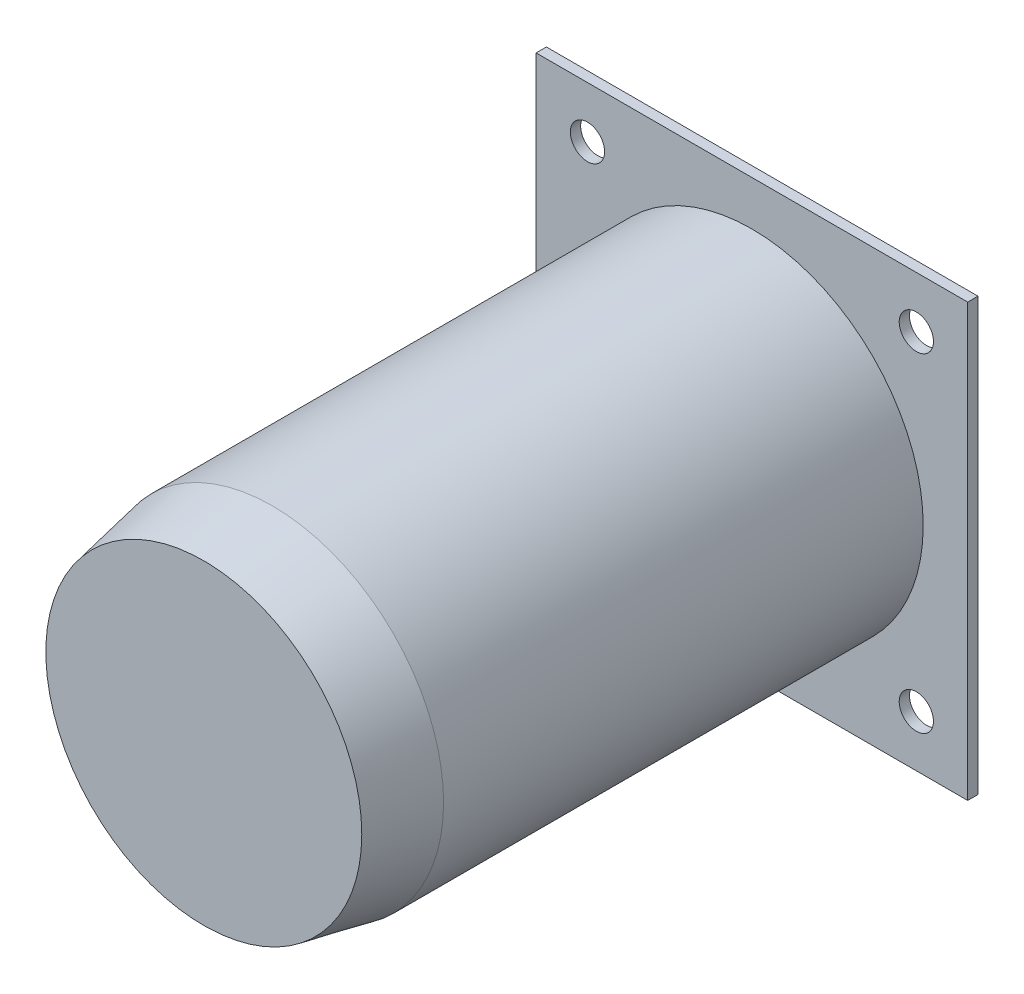
ISO-10303-21;
HEADER;
FILE_DESCRIPTION(('STEP AP214'),'2;1');
FILE_NAME('part.step','',(''),(''),'','','');
FILE_SCHEMA(('AUTOMOTIVE_DESIGN { 1 0 10303 214 1 1 1 1 }'));
ENDSEC;
DATA;
#1=APPLICATION_CONTEXT('core data for automotive mechanical design processes');
#2=APPLICATION_PROTOCOL_DEFINITION('international standard','automotive_design',2000,#1);
#3=PRODUCT_CONTEXT('',#1,'mechanical');
#4=PRODUCT('Part','Part','',(#3));
#5=PRODUCT_RELATED_PRODUCT_CATEGORY('part','',(#4));
#6=PRODUCT_DEFINITION_FORMATION('','',#4);
#7=PRODUCT_DEFINITION_CONTEXT('part definition',#1,'design');
#8=PRODUCT_DEFINITION('design','',#6,#7);
#9=PRODUCT_DEFINITION_SHAPE('','',#8);
#10=(LENGTH_UNIT() NAMED_UNIT(*) SI_UNIT(.MILLI.,.METRE.));
#11=(NAMED_UNIT(*) PLANE_ANGLE_UNIT() SI_UNIT($,.RADIAN.));
#12=(NAMED_UNIT(*) SI_UNIT($,.STERADIAN.) SOLID_ANGLE_UNIT());
#13=UNCERTAINTY_MEASURE_WITH_UNIT(LENGTH_MEASURE(1.E-05),#10,'distance_accuracy_value','');
#14=(GEOMETRIC_REPRESENTATION_CONTEXT(3) GLOBAL_UNCERTAINTY_ASSIGNED_CONTEXT((#13)) GLOBAL_UNIT_ASSIGNED_CONTEXT((#10,
#11,#12)) REPRESENTATION_CONTEXT('',''));
#15=CARTESIAN_POINT('',(0.,0.,0.));
#16=DIRECTION('',(0.,0.,1.));
#17=DIRECTION('',(1.,0.,0.));
#18=AXIS2_PLACEMENT_3D('',#15,#16,#17);
#19=CARTESIAN_POINT('',(0.,0.,1.5));
#20=DIRECTION('',(0.,0.,-1.));
#21=DIRECTION('',(-1.,0.,0.));
#22=AXIS2_PLACEMENT_3D('',#19,#20,#21);
#23=PLANE('',#22);
#24=CARTESIAN_POINT('',(0.,0.,1.5));
#25=DIRECTION('',(0.,0.,1.));
#26=DIRECTION('',(1.,0.,0.));
#27=AXIS2_PLACEMENT_3D('',#24,#25,#26);
#28=CIRCLE('',#27,25.);
#29=CARTESIAN_POINT('',(25.,0.,1.5));
#30=VERTEX_POINT('',#29);
#31=EDGE_CURVE('E123',#30,#30,#28,.T.);
#32=ORIENTED_EDGE('',*,*,#31,.F.);
#33=EDGE_LOOP('',(#32));
#34=FACE_BOUND('',#33,.T.);
#35=DIRECTION('',(0.,1.,0.));
#36=VECTOR('',#35,1.);
#37=CARTESIAN_POINT('',(31.5,-31.5,1.5));
#38=LINE('',#37,#36);
#39=CARTESIAN_POINT('',(31.5,-31.5,1.5));
#40=VERTEX_POINT('',#39);
#41=CARTESIAN_POINT('',(31.5,31.5,1.5));
#42=VERTEX_POINT('',#41);
#43=EDGE_CURVE('E99',#40,#42,#38,.T.);
#44=ORIENTED_EDGE('',*,*,#43,.T.);
#45=DIRECTION('',(-1.,0.,0.));
#46=VECTOR('',#45,1.);
#47=CARTESIAN_POINT('',(-31.5,31.5,1.5));
#48=LINE('',#47,#46);
#49=CARTESIAN_POINT('',(-31.5,31.5,1.5));
#50=VERTEX_POINT('',#49);
#51=EDGE_CURVE('E94',#42,#50,#48,.T.);
#52=ORIENTED_EDGE('',*,*,#51,.T.);
#53=DIRECTION('',(0.,-1.,0.));
#54=VECTOR('',#53,1.);
#55=CARTESIAN_POINT('',(-31.5,-31.5,1.5));
#56=LINE('',#55,#54);
#57=CARTESIAN_POINT('',(-31.5,-31.5,1.5));
#58=VERTEX_POINT('',#57);
#59=EDGE_CURVE('E97',#50,#58,#56,.T.);
#60=ORIENTED_EDGE('',*,*,#59,.T.);
#61=DIRECTION('',(1.,0.,0.));
#62=VECTOR('',#61,1.);
#63=CARTESIAN_POINT('',(-31.5,-31.5,1.5));
#64=LINE('',#63,#62);
#65=EDGE_CURVE('E63',#58,#40,#64,.T.);
#66=ORIENTED_EDGE('',*,*,#65,.T.);
#67=EDGE_LOOP('',(#44,#52,#60,#66));
#68=FACE_BOUND('',#67,.T.);
#69=CARTESIAN_POINT('',(24.,24.,1.5));
#70=DIRECTION('',(0.,0.,1.));
#71=DIRECTION('',(1.,0.,0.));
#72=AXIS2_PLACEMENT_3D('',#69,#70,#71);
#73=CIRCLE('',#72,2.5);
#74=CARTESIAN_POINT('',(26.5,24.,1.5));
#75=VERTEX_POINT('',#74);
#76=EDGE_CURVE('E117',#75,#75,#73,.T.);
#77=ORIENTED_EDGE('',*,*,#76,.F.);
#78=EDGE_LOOP('',(#77));
#79=FACE_BOUND('',#78,.T.);
#80=CARTESIAN_POINT('',(24.0000000000013,-24.,1.5));
#81=DIRECTION('',(0.,0.,1.));
#82=DIRECTION('',(1.,0.,0.));
#83=AXIS2_PLACEMENT_3D('',#80,#81,#82);
#84=CIRCLE('',#83,2.49999999999967);
#85=CARTESIAN_POINT('',(26.500000000001,-24.,1.5));
#86=VERTEX_POINT('',#85);
#87=EDGE_CURVE('E145',#86,#86,#84,.T.);
#88=ORIENTED_EDGE('',*,*,#87,.F.);
#89=EDGE_LOOP('',(#88));
#90=FACE_BOUND('',#89,.T.);
#91=CARTESIAN_POINT('',(-23.9999999999987,-24.0000000000013,1.5));
#92=DIRECTION('',(0.,0.,1.));
#93=DIRECTION('',(1.,0.,0.));
#94=AXIS2_PLACEMENT_3D('',#91,#92,#93);
#95=CIRCLE('',#94,2.500000000001);
#96=CARTESIAN_POINT('',(-21.4999999999977,-24.0000000000013,1.5));
#97=VERTEX_POINT('',#96);
#98=EDGE_CURVE('E139',#97,#97,#95,.T.);
#99=ORIENTED_EDGE('',*,*,#98,.F.);
#100=EDGE_LOOP('',(#99));
#101=FACE_BOUND('',#100,.T.);
#102=CARTESIAN_POINT('',(-24.,23.9999999999987,1.5));
#103=DIRECTION('',(0.,0.,1.));
#104=DIRECTION('',(1.,0.,0.));
#105=AXIS2_PLACEMENT_3D('',#102,#103,#104);
#106=CIRCLE('',#105,2.50000000000145);
#107=CARTESIAN_POINT('',(-21.4999999999985,23.9999999999987,1.5));
#108=VERTEX_POINT('',#107);
#109=EDGE_CURVE('E132',#108,#108,#106,.T.);
#110=ORIENTED_EDGE('',*,*,#109,.F.);
#111=EDGE_LOOP('',(#110));
#112=FACE_BOUND('',#111,.T.);
#113=ADVANCED_FACE('F46',(#34,#68,#79,#90,#101,#112),#23,.F.);
#114=CARTESIAN_POINT('',(0.,0.,0.));
#115=DIRECTION('',(0.,0.,-1.));
#116=DIRECTION('',(-1.,0.,0.));
#117=AXIS2_PLACEMENT_3D('',#114,#115,#116);
#118=PLANE('',#117);
#119=CARTESIAN_POINT('',(-23.9999999999987,-24.0000000000013,0.));
#120=DIRECTION('',(0.,0.,1.));
#121=DIRECTION('',(1.,0.,0.));
#122=AXIS2_PLACEMENT_3D('',#119,#120,#121);
#123=CIRCLE('',#122,2.500000000001);
#124=CARTESIAN_POINT('',(-21.4999999999977,-24.0000000000013,0.));
#125=VERTEX_POINT('',#124);
#126=EDGE_CURVE('E135',#125,#125,#123,.T.);
#127=ORIENTED_EDGE('',*,*,#126,.T.);
#128=EDGE_LOOP('',(#127));
#129=FACE_BOUND('',#128,.T.);
#130=CARTESIAN_POINT('',(24.,24.,0.));
#131=DIRECTION('',(0.,0.,1.));
#132=DIRECTION('',(1.,0.,0.));
#133=AXIS2_PLACEMENT_3D('',#130,#131,#132);
#134=CIRCLE('',#133,2.5);
#135=CARTESIAN_POINT('',(26.5,24.,0.));
#136=VERTEX_POINT('',#135);
#137=EDGE_CURVE('E148',#136,#136,#134,.T.);
#138=ORIENTED_EDGE('',*,*,#137,.T.);
#139=EDGE_LOOP('',(#138));
#140=FACE_BOUND('',#139,.T.);
#141=DIRECTION('',(0.,1.,0.));
#142=VECTOR('',#141,1.);
#143=CARTESIAN_POINT('',(31.5,-31.5,0.));
#144=LINE('',#143,#142);
#145=CARTESIAN_POINT('',(31.5,-31.5,0.));
#146=VERTEX_POINT('',#145);
#147=CARTESIAN_POINT('',(31.5,31.5,0.));
#148=VERTEX_POINT('',#147);
#149=EDGE_CURVE('E114',#146,#148,#144,.T.);
#150=ORIENTED_EDGE('',*,*,#149,.F.);
#151=DIRECTION('',(1.,0.,0.));
#152=VECTOR('',#151,1.);
#153=CARTESIAN_POINT('',(-31.5,-31.5,0.));
#154=LINE('',#153,#152);
#155=CARTESIAN_POINT('',(-31.5,-31.5,0.));
#156=VERTEX_POINT('',#155);
#157=EDGE_CURVE('E86',#156,#146,#154,.T.);
#158=ORIENTED_EDGE('',*,*,#157,.F.);
#159=DIRECTION('',(0.,-1.,0.));
#160=VECTOR('',#159,1.);
#161=CARTESIAN_POINT('',(-31.5,-31.5,0.));
#162=LINE('',#161,#160);
#163=CARTESIAN_POINT('',(-31.5,31.5,0.));
#164=VERTEX_POINT('',#163);
#165=EDGE_CURVE('E80',#164,#156,#162,.T.);
#166=ORIENTED_EDGE('',*,*,#165,.F.);
#167=DIRECTION('',(-1.,0.,0.));
#168=VECTOR('',#167,1.);
#169=CARTESIAN_POINT('',(-31.5,31.5,0.));
#170=LINE('',#169,#168);
#171=EDGE_CURVE('E104',#148,#164,#170,.T.);
#172=ORIENTED_EDGE('',*,*,#171,.F.);
#173=EDGE_LOOP('',(#150,#158,#166,#172));
#174=FACE_BOUND('',#173,.T.);
#175=CARTESIAN_POINT('',(24.0000000000013,-24.,0.));
#176=DIRECTION('',(0.,0.,1.));
#177=DIRECTION('',(1.,0.,0.));
#178=AXIS2_PLACEMENT_3D('',#175,#176,#177);
#179=CIRCLE('',#178,2.49999999999967);
#180=CARTESIAN_POINT('',(26.500000000001,-24.,0.));
#181=VERTEX_POINT('',#180);
#182=EDGE_CURVE('E142',#181,#181,#179,.T.);
#183=ORIENTED_EDGE('',*,*,#182,.T.);
#184=EDGE_LOOP('',(#183));
#185=FACE_BOUND('',#184,.T.);
#186=CARTESIAN_POINT('',(-24.,23.9999999999987,0.));
#187=DIRECTION('',(0.,0.,1.));
#188=DIRECTION('',(1.,0.,0.));
#189=AXIS2_PLACEMENT_3D('',#186,#187,#188);
#190=CIRCLE('',#189,2.50000000000145);
#191=CARTESIAN_POINT('',(-21.4999999999985,23.9999999999987,0.));
#192=VERTEX_POINT('',#191);
#193=EDGE_CURVE('E136',#192,#192,#190,.T.);
#194=ORIENTED_EDGE('',*,*,#193,.T.);
#195=EDGE_LOOP('',(#194));
#196=FACE_BOUND('',#195,.T.);
#197=ADVANCED_FACE('F156',(#129,#140,#174,#185,#196),#118,.T.);
#198=CARTESIAN_POINT('',(31.5,-31.5,1.5));
#199=DIRECTION('',(-1.,0.,0.));
#200=DIRECTION('',(0.,0.,1.));
#201=AXIS2_PLACEMENT_3D('',#198,#199,#200);
#202=PLANE('',#201);
#203=ORIENTED_EDGE('',*,*,#149,.T.);
#204=DIRECTION('',(0.,0.,-1.));
#205=VECTOR('',#204,1.);
#206=CARTESIAN_POINT('',(31.5,31.5,1.5));
#207=LINE('',#206,#205);
#208=EDGE_CURVE('E105',#42,#148,#207,.T.);
#209=ORIENTED_EDGE('',*,*,#208,.F.);
#210=ORIENTED_EDGE('',*,*,#43,.F.);
#211=DIRECTION('',(0.,0.,-1.));
#212=VECTOR('',#211,1.);
#213=CARTESIAN_POINT('',(31.5,-31.5,1.5));
#214=LINE('',#213,#212);
#215=EDGE_CURVE('E110',#40,#146,#214,.T.);
#216=ORIENTED_EDGE('',*,*,#215,.T.);
#217=EDGE_LOOP('',(#203,#209,#210,#216));
#218=FACE_BOUND('',#217,.T.);
#219=ADVANCED_FACE('F179',(#218),#202,.F.);
#220=CARTESIAN_POINT('',(-31.5,31.5,1.5));
#221=DIRECTION('',(0.,-1.,0.));
#222=DIRECTION('',(0.,0.,-1.));
#223=AXIS2_PLACEMENT_3D('',#220,#221,#222);
#224=PLANE('',#223);
#225=ORIENTED_EDGE('',*,*,#171,.T.);
#226=DIRECTION('',(0.,0.,-1.));
#227=VECTOR('',#226,1.);
#228=CARTESIAN_POINT('',(-31.5,31.5,1.5));
#229=LINE('',#228,#227);
#230=EDGE_CURVE('E102',#50,#164,#229,.T.);
#231=ORIENTED_EDGE('',*,*,#230,.F.);
#232=ORIENTED_EDGE('',*,*,#51,.F.);
#233=ORIENTED_EDGE('',*,*,#208,.T.);
#234=EDGE_LOOP('',(#225,#231,#232,#233));
#235=FACE_BOUND('',#234,.T.);
#236=ADVANCED_FACE('F103',(#235),#224,.F.);
#237=CARTESIAN_POINT('',(-31.5,-31.5,1.5));
#238=DIRECTION('',(1.,0.,0.));
#239=DIRECTION('',(0.,0.,-1.));
#240=AXIS2_PLACEMENT_3D('',#237,#238,#239);
#241=PLANE('',#240);
#242=ORIENTED_EDGE('',*,*,#165,.T.);
#243=DIRECTION('',(0.,0.,-1.));
#244=VECTOR('',#243,1.);
#245=CARTESIAN_POINT('',(-31.5,-31.5,1.5));
#246=LINE('',#245,#244);
#247=EDGE_CURVE('E106',#58,#156,#246,.T.);
#248=ORIENTED_EDGE('',*,*,#247,.F.);
#249=ORIENTED_EDGE('',*,*,#59,.F.);
#250=ORIENTED_EDGE('',*,*,#230,.T.);
#251=EDGE_LOOP('',(#242,#248,#249,#250));
#252=FACE_BOUND('',#251,.T.);
#253=ADVANCED_FACE('F108',(#252),#241,.F.);
#254=CARTESIAN_POINT('',(-31.5,-31.5,1.5));
#255=DIRECTION('',(0.,1.,0.));
#256=DIRECTION('',(0.,0.,1.));
#257=AXIS2_PLACEMENT_3D('',#254,#255,#256);
#258=PLANE('',#257);
#259=ORIENTED_EDGE('',*,*,#157,.T.);
#260=ORIENTED_EDGE('',*,*,#215,.F.);
#261=ORIENTED_EDGE('',*,*,#65,.F.);
#262=ORIENTED_EDGE('',*,*,#247,.T.);
#263=EDGE_LOOP('',(#259,#260,#261,#262));
#264=FACE_BOUND('',#263,.T.);
#265=ADVANCED_FACE('F162',(#264),#258,.F.);
#266=CARTESIAN_POINT('',(24.,24.,1.5));
#267=DIRECTION('',(0.,0.,-1.));
#268=DIRECTION('',(-1.,0.,0.));
#269=AXIS2_PLACEMENT_3D('',#266,#267,#268);
#270=CYLINDRICAL_SURFACE('',#269,2.5);
#271=ORIENTED_EDGE('',*,*,#76,.T.);
#272=EDGE_LOOP('',(#271));
#273=FACE_BOUND('',#272,.T.);
#274=ORIENTED_EDGE('',*,*,#137,.F.);
#275=EDGE_LOOP('',(#274));
#276=FACE_BOUND('',#275,.T.);
#277=ADVANCED_FACE('F159',(#273,#276),#270,.F.);
#278=CARTESIAN_POINT('',(24.0000000000013,-24.,1.5));
#279=DIRECTION('',(0.,0.,-1.));
#280=DIRECTION('',(-1.,0.,0.));
#281=AXIS2_PLACEMENT_3D('',#278,#279,#280);
#282=CYLINDRICAL_SURFACE('',#281,2.49999999999967);
#283=ORIENTED_EDGE('',*,*,#87,.T.);
#284=EDGE_LOOP('',(#283));
#285=FACE_BOUND('',#284,.T.);
#286=ORIENTED_EDGE('',*,*,#182,.F.);
#287=EDGE_LOOP('',(#286));
#288=FACE_BOUND('',#287,.T.);
#289=ADVANCED_FACE('F161',(#285,#288),#282,.F.);
#290=CARTESIAN_POINT('',(-23.9999999999987,-24.0000000000013,1.5));
#291=DIRECTION('',(0.,0.,-1.));
#292=DIRECTION('',(-1.,0.,0.));
#293=AXIS2_PLACEMENT_3D('',#290,#291,#292);
#294=CYLINDRICAL_SURFACE('',#293,2.500000000001);
#295=ORIENTED_EDGE('',*,*,#98,.T.);
#296=EDGE_LOOP('',(#295));
#297=FACE_BOUND('',#296,.T.);
#298=ORIENTED_EDGE('',*,*,#126,.F.);
#299=EDGE_LOOP('',(#298));
#300=FACE_BOUND('',#299,.T.);
#301=ADVANCED_FACE('F169',(#297,#300),#294,.F.);
#302=CARTESIAN_POINT('',(-24.,23.9999999999987,1.5));
#303=DIRECTION('',(0.,0.,-1.));
#304=DIRECTION('',(-1.,0.,0.));
#305=AXIS2_PLACEMENT_3D('',#302,#303,#304);
#306=CYLINDRICAL_SURFACE('',#305,2.50000000000145);
#307=ORIENTED_EDGE('',*,*,#109,.T.);
#308=EDGE_LOOP('',(#307));
#309=FACE_BOUND('',#308,.T.);
#310=ORIENTED_EDGE('',*,*,#193,.F.);
#311=EDGE_LOOP('',(#310));
#312=FACE_BOUND('',#311,.T.);
#313=ADVANCED_FACE('F196',(#309,#312),#306,.F.);
#314=CARTESIAN_POINT('',(0.,0.,81.5));
#315=DIRECTION('',(0.,0.,-1.));
#316=DIRECTION('',(-1.,0.,0.));
#317=AXIS2_PLACEMENT_3D('',#314,#315,#316);
#318=CYLINDRICAL_SURFACE('',#317,25.);
#319=CARTESIAN_POINT('',(0.,0.,71.4999999999999));
#320=DIRECTION('',(0.,0.,1.));
#321=DIRECTION('',(1.,0.,0.));
#322=AXIS2_PLACEMENT_3D('',#319,#320,#321);
#323=CIRCLE('',#322,25.);
#324=CARTESIAN_POINT('',(25.,0.,71.4999999999999));
#325=VERTEX_POINT('',#324);
#326=EDGE_CURVE('E13',#325,#325,#323,.F.);
#327=ORIENTED_EDGE('',*,*,#326,.T.);
#328=EDGE_LOOP('',(#327));
#329=FACE_BOUND('',#328,.T.);
#330=ORIENTED_EDGE('',*,*,#31,.T.);
#331=EDGE_LOOP('',(#330));
#332=FACE_BOUND('',#331,.T.);
#333=ADVANCED_FACE('F198',(#329,#332),#318,.T.);
#334=CARTESIAN_POINT('',(0.,0.,81.5));
#335=DIRECTION('',(0.,0.,1.));
#336=DIRECTION('',(1.,0.,0.));
#337=AXIS2_PLACEMENT_3D('',#334,#335,#336);
#338=PLANE('',#337);
#339=CARTESIAN_POINT('',(0.,0.,81.5));
#340=DIRECTION('',(0.,0.,1.));
#341=DIRECTION('',(1.,0.,0.));
#342=AXIS2_PLACEMENT_3D('',#339,#340,#341);
#343=CIRCLE('',#342,23.0561969086228);
#344=CARTESIAN_POINT('',(23.0561969086228,0.,81.5));
#345=VERTEX_POINT('',#344);
#346=EDGE_CURVE('E55',#345,#345,#343,.T.);
#347=ORIENTED_EDGE('',*,*,#346,.T.);
#348=EDGE_LOOP('',(#347));
#349=FACE_BOUND('',#348,.T.);
#350=ADVANCED_FACE('F205',(#349),#338,.T.);
#351=CARTESIAN_POINT('',(0.,0.,81.5));
#352=DIRECTION('',(0.,0.,-1.));
#353=DIRECTION('',(-1.,0.,0.));
#354=AXIS2_PLACEMENT_3D('',#351,#352,#353);
#355=CONICAL_SURFACE('',#354,23.0561969086228,0.191986217719374);
#356=ORIENTED_EDGE('',*,*,#326,.F.);
#357=EDGE_LOOP('',(#356));
#358=FACE_BOUND('',#357,.T.);
#359=ORIENTED_EDGE('',*,*,#346,.F.);
#360=EDGE_LOOP('',(#359));
#361=FACE_BOUND('',#360,.T.);
#362=ADVANCED_FACE('F48',(#358,#361),#355,.T.);
#363=CLOSED_SHELL('',(#113,#197,#219,#236,#253,#265,#277,#289,#301,#313,#333,#350,#362));
#364=MANIFOLD_SOLID_BREP('B2',#363);
#365=ADVANCED_BREP_SHAPE_REPRESENTATION('',(#18,#364),#14);
#366=SHAPE_DEFINITION_REPRESENTATION(#9,#365);
ENDSEC;
END-ISO-10303-21;
